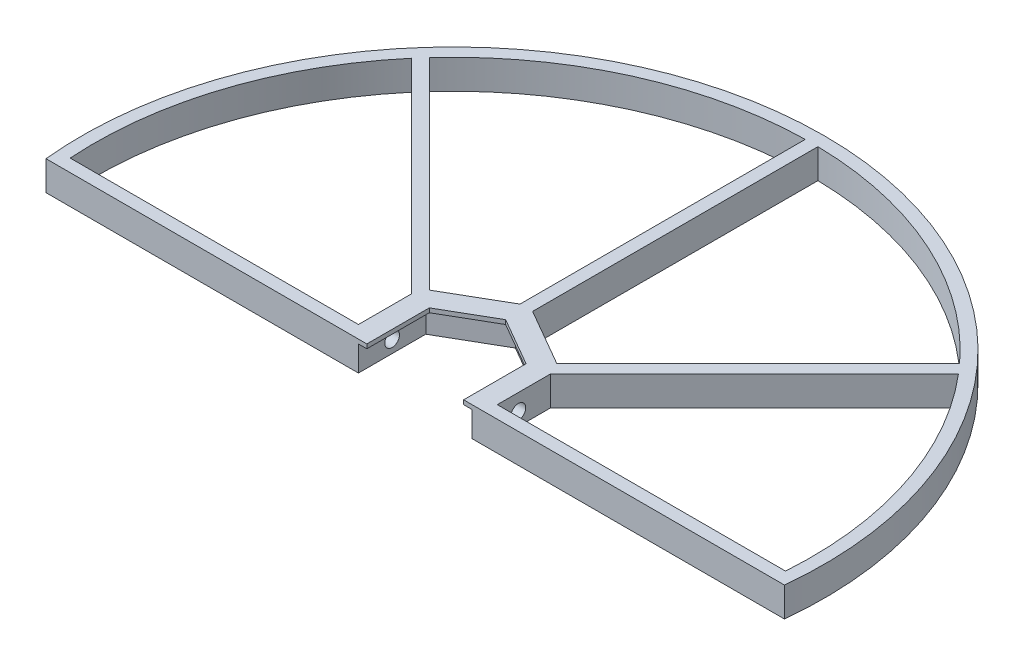
ISO-10303-21;
HEADER;
FILE_DESCRIPTION(('STEP AP214'),'2;1');
FILE_NAME('part.step','',(''),(''),'','','');
FILE_SCHEMA(('AUTOMOTIVE_DESIGN { 1 0 10303 214 1 1 1 1 }'));
ENDSEC;
DATA;
#1=APPLICATION_CONTEXT('core data for automotive mechanical design processes');
#2=APPLICATION_PROTOCOL_DEFINITION('international standard','automotive_design',2000,#1);
#3=PRODUCT_CONTEXT('',#1,'mechanical');
#4=PRODUCT('Part','Part','',(#3));
#5=PRODUCT_RELATED_PRODUCT_CATEGORY('part','',(#4));
#6=PRODUCT_DEFINITION_FORMATION('','',#4);
#7=PRODUCT_DEFINITION_CONTEXT('part definition',#1,'design');
#8=PRODUCT_DEFINITION('design','',#6,#7);
#9=PRODUCT_DEFINITION_SHAPE('','',#8);
#10=(LENGTH_UNIT() NAMED_UNIT(*) SI_UNIT(.MILLI.,.METRE.));
#11=(NAMED_UNIT(*) PLANE_ANGLE_UNIT() SI_UNIT($,.RADIAN.));
#12=(NAMED_UNIT(*) SI_UNIT($,.STERADIAN.) SOLID_ANGLE_UNIT());
#13=UNCERTAINTY_MEASURE_WITH_UNIT(LENGTH_MEASURE(1.E-05),#10,'distance_accuracy_value','');
#14=(GEOMETRIC_REPRESENTATION_CONTEXT(3) GLOBAL_UNCERTAINTY_ASSIGNED_CONTEXT((#13)) GLOBAL_UNIT_ASSIGNED_CONTEXT((#10,
#11,#12)) REPRESENTATION_CONTEXT('',''));
#15=CARTESIAN_POINT('',(0.,0.,0.));
#16=DIRECTION('',(0.,0.,1.));
#17=DIRECTION('',(1.,0.,0.));
#18=AXIS2_PLACEMENT_3D('',#15,#16,#17);
#19=CARTESIAN_POINT('',(16.5,7.,0.));
#20=DIRECTION('',(-1.,0.,0.));
#21=DIRECTION('',(0.,0.,1.));
#22=AXIS2_PLACEMENT_3D('',#19,#20,#21);
#23=PLANE('',#22);
#24=DIRECTION('',(0.,0.,-1.));
#25=VECTOR('',#24,1.);
#26=CARTESIAN_POINT('',(16.5,0.,0.));
#27=LINE('',#26,#25);
#28=CARTESIAN_POINT('',(16.5,0.,0.));
#29=VERTEX_POINT('',#28);
#30=CARTESIAN_POINT('',(16.5,0.,-12.6103877364479));
#31=VERTEX_POINT('',#30);
#32=EDGE_CURVE('E370',#29,#31,#27,.T.);
#33=ORIENTED_EDGE('',*,*,#32,.T.);
#34=DIRECTION('',(0.,-1.,0.));
#35=VECTOR('',#34,1.);
#36=CARTESIAN_POINT('',(16.5,7.,-12.6103877364479));
#37=LINE('',#36,#35);
#38=CARTESIAN_POINT('',(16.5,7.,-12.6103877364479));
#39=VERTEX_POINT('',#38);
#40=EDGE_CURVE('E413',#39,#31,#37,.T.);
#41=ORIENTED_EDGE('',*,*,#40,.F.);
#42=DIRECTION('',(0.,0.,-1.));
#43=VECTOR('',#42,1.);
#44=CARTESIAN_POINT('',(16.5,7.,0.));
#45=LINE('',#44,#43);
#46=CARTESIAN_POINT('',(16.5,7.,0.));
#47=VERTEX_POINT('',#46);
#48=EDGE_CURVE('E327',#47,#39,#45,.T.);
#49=ORIENTED_EDGE('',*,*,#48,.F.);
#50=DIRECTION('',(0.,-1.,0.));
#51=VECTOR('',#50,1.);
#52=CARTESIAN_POINT('',(16.5,7.,0.));
#53=LINE('',#52,#51);
#54=EDGE_CURVE('E416',#47,#29,#53,.T.);
#55=ORIENTED_EDGE('',*,*,#54,.T.);
#56=EDGE_LOOP('',(#33,#41,#49,#55));
#57=FACE_BOUND('',#56,.T.);
#58=CARTESIAN_POINT('',(16.5,3.,-5.0103877364479));
#59=DIRECTION('',(-1.,0.,0.));
#60=DIRECTION('',(0.,0.,1.));
#61=AXIS2_PLACEMENT_3D('',#58,#59,#60);
#62=CIRCLE('',#61,1.74999999999999);
#63=CARTESIAN_POINT('',(16.5,3.,-3.26038773644791));
#64=VERTEX_POINT('',#63);
#65=EDGE_CURVE('E284',#64,#64,#62,.F.);
#66=ORIENTED_EDGE('',*,*,#65,.F.);
#67=EDGE_LOOP('',(#66));
#68=FACE_BOUND('',#67,.T.);
#69=ADVANCED_FACE('F35',(#57,#68),#23,.F.);
#70=CARTESIAN_POINT('',(0.,7.,3.));
#71=DIRECTION('',(0.,0.,-1.));
#72=DIRECTION('',(-1.,0.,0.));
#73=AXIS2_PLACEMENT_3D('',#70,#71,#72);
#74=PLANE('',#73);
#75=DIRECTION('',(1.,0.,0.));
#76=VECTOR('',#75,1.);
#77=CARTESIAN_POINT('',(0.,0.,3.));
#78=LINE('',#77,#76);
#79=CARTESIAN_POINT('',(-87.7511766839998,0.,3.));
#80=VERTEX_POINT('',#79);
#81=CARTESIAN_POINT('',(-13.5,0.,3.));
#82=VERTEX_POINT('',#81);
#83=EDGE_CURVE('E303',#80,#82,#78,.T.);
#84=ORIENTED_EDGE('',*,*,#83,.T.);
#85=DIRECTION('',(0.,1.,0.));
#86=VECTOR('',#85,1.);
#87=CARTESIAN_POINT('',(-13.5,-3.,3.));
#88=LINE('',#87,#86);
#89=CARTESIAN_POINT('',(-13.5,6.,3.));
#90=VERTEX_POINT('',#89);
#91=EDGE_CURVE('E246',#82,#90,#88,.T.);
#92=ORIENTED_EDGE('',*,*,#91,.T.);
#93=DIRECTION('',(1.,0.,0.));
#94=VECTOR('',#93,1.);
#95=CARTESIAN_POINT('',(-13.5,6.,3.));
#96=LINE('',#95,#94);
#97=CARTESIAN_POINT('',(-11.5,6.,3.));
#98=VERTEX_POINT('',#97);
#99=EDGE_CURVE('E239',#90,#98,#96,.T.);
#100=ORIENTED_EDGE('',*,*,#99,.T.);
#101=DIRECTION('',(0.,1.,0.));
#102=VECTOR('',#101,1.);
#103=CARTESIAN_POINT('',(-11.5,6.,3.));
#104=LINE('',#103,#102);
#105=CARTESIAN_POINT('',(-11.5,7.,3.));
#106=VERTEX_POINT('',#105);
#107=EDGE_CURVE('E224',#98,#106,#104,.T.);
#108=ORIENTED_EDGE('',*,*,#107,.T.);
#109=DIRECTION('',(1.,0.,0.));
#110=VECTOR('',#109,1.);
#111=CARTESIAN_POINT('',(0.,7.,3.));
#112=LINE('',#111,#110);
#113=CARTESIAN_POINT('',(-87.7511766839998,7.,3.));
#114=VERTEX_POINT('',#113);
#115=EDGE_CURVE('E340',#114,#106,#112,.T.);
#116=ORIENTED_EDGE('',*,*,#115,.F.);
#117=DIRECTION('',(0.,-1.,0.));
#118=VECTOR('',#117,1.);
#119=CARTESIAN_POINT('',(-87.7511766839998,7.,3.));
#120=LINE('',#119,#118);
#121=EDGE_CURVE('E11',#114,#80,#120,.T.);
#122=ORIENTED_EDGE('',*,*,#121,.T.);
#123=EDGE_LOOP('',(#84,#92,#100,#108,#116,#122));
#124=FACE_BOUND('',#123,.T.);
#125=ADVANCED_FACE('F245',(#124),#74,.F.);
#126=CARTESIAN_POINT('',(0.,7.,-6.));
#127=DIRECTION('',(0.,-1.,0.));
#128=DIRECTION('',(0.,0.,-1.));
#129=AXIS2_PLACEMENT_3D('',#126,#127,#128);
#130=CYLINDRICAL_SURFACE('',#129,88.2115015710907);
#131=CARTESIAN_POINT('',(0.,0.,-6.));
#132=DIRECTION('',(0.,1.,0.));
#133=DIRECTION('',(0.,0.,1.));
#134=AXIS2_PLACEMENT_3D('',#131,#132,#133);
#135=CIRCLE('',#134,88.2115015710907);
#136=CARTESIAN_POINT('',(87.7511766839998,0.,3.));
#137=VERTEX_POINT('',#136);
#138=EDGE_CURVE('E391',#80,#137,#135,.F.);
#139=ORIENTED_EDGE('',*,*,#138,.F.);
#140=ORIENTED_EDGE('',*,*,#121,.F.);
#141=CARTESIAN_POINT('',(0.,7.,-6.));
#142=DIRECTION('',(0.,1.,0.));
#143=DIRECTION('',(0.,0.,1.));
#144=AXIS2_PLACEMENT_3D('',#141,#142,#143);
#145=CIRCLE('',#144,88.2115015710907);
#146=CARTESIAN_POINT('',(87.7511766839998,7.,3.));
#147=VERTEX_POINT('',#146);
#148=EDGE_CURVE('E336',#114,#147,#145,.F.);
#149=ORIENTED_EDGE('',*,*,#148,.T.);
#150=DIRECTION('',(0.,-1.,0.));
#151=VECTOR('',#150,1.);
#152=CARTESIAN_POINT('',(87.7511766839998,7.,3.));
#153=LINE('',#152,#151);
#154=EDGE_CURVE('E44',#147,#137,#153,.T.);
#155=ORIENTED_EDGE('',*,*,#154,.T.);
#156=EDGE_LOOP('',(#139,#140,#149,#155));
#157=FACE_BOUND('',#156,.T.);
#158=ADVANCED_FACE('F475',(#157),#130,.T.);
#159=CARTESIAN_POINT('',(13.5,7.,0.));
#160=DIRECTION('',(-1.,0.,0.));
#161=DIRECTION('',(0.,0.,1.));
#162=AXIS2_PLACEMENT_3D('',#159,#160,#161);
#163=PLANE('',#162);
#164=DIRECTION('',(0.,0.,-1.));
#165=VECTOR('',#164,1.);
#166=CARTESIAN_POINT('',(13.5,6.,-13.));
#167=LINE('',#166,#165);
#168=CARTESIAN_POINT('',(13.5,6.,3.));
#169=VERTEX_POINT('',#168);
#170=CARTESIAN_POINT('',(13.5,6.,-13.));
#171=VERTEX_POINT('',#170);
#172=EDGE_CURVE('E261',#169,#171,#167,.T.);
#173=ORIENTED_EDGE('',*,*,#172,.T.);
#174=DIRECTION('',(0.,-1.,0.));
#175=VECTOR('',#174,1.);
#176=CARTESIAN_POINT('',(13.5,7.,-13.));
#177=LINE('',#176,#175);
#178=CARTESIAN_POINT('',(13.5,0.,-13.));
#179=VERTEX_POINT('',#178);
#180=EDGE_CURVE('E399',#171,#179,#177,.T.);
#181=ORIENTED_EDGE('',*,*,#180,.T.);
#182=DIRECTION('',(0.,0.,-1.));
#183=VECTOR('',#182,1.);
#184=CARTESIAN_POINT('',(13.5,0.,0.));
#185=LINE('',#184,#183);
#186=CARTESIAN_POINT('',(13.5,0.,3.));
#187=VERTEX_POINT('',#186);
#188=EDGE_CURVE('E379',#187,#179,#185,.T.);
#189=ORIENTED_EDGE('',*,*,#188,.F.);
#190=DIRECTION('',(0.,1.,0.));
#191=VECTOR('',#190,1.);
#192=CARTESIAN_POINT('',(13.5,-3.,3.));
#193=LINE('',#192,#191);
#194=EDGE_CURVE('E295',#187,#169,#193,.T.);
#195=ORIENTED_EDGE('',*,*,#194,.T.);
#196=EDGE_LOOP('',(#173,#181,#189,#195));
#197=FACE_BOUND('',#196,.T.);
#198=CARTESIAN_POINT('',(13.5,3.,-5.0103877364479));
#199=DIRECTION('',(-1.,0.,0.));
#200=DIRECTION('',(0.,0.,1.));
#201=AXIS2_PLACEMENT_3D('',#198,#199,#200);
#202=CIRCLE('',#201,1.74999999999999);
#203=CARTESIAN_POINT('',(13.5,3.,-3.26038773644791));
#204=VERTEX_POINT('',#203);
#205=EDGE_CURVE('E292',#204,#204,#202,.T.);
#206=ORIENTED_EDGE('',*,*,#205,.F.);
#207=EDGE_LOOP('',(#206));
#208=FACE_BOUND('',#207,.T.);
#209=ADVANCED_FACE('F513',(#197,#208),#163,.T.);
#210=CARTESIAN_POINT('',(-13.5,7.,0.));
#211=DIRECTION('',(-1.,0.,0.));
#212=DIRECTION('',(0.,0.,1.));
#213=AXIS2_PLACEMENT_3D('',#210,#211,#212);
#214=PLANE('',#213);
#215=CARTESIAN_POINT('',(-13.5,3.,-5.01038773644791));
#216=DIRECTION('',(-1.,0.,0.));
#217=DIRECTION('',(0.,0.,1.));
#218=AXIS2_PLACEMENT_3D('',#215,#216,#217);
#219=CIRCLE('',#218,1.74999999999999);
#220=CARTESIAN_POINT('',(-13.5,3.,-3.26038773644792));
#221=VERTEX_POINT('',#220);
#222=EDGE_CURVE('E287',#221,#221,#219,.T.);
#223=ORIENTED_EDGE('',*,*,#222,.T.);
#224=EDGE_LOOP('',(#223));
#225=FACE_BOUND('',#224,.T.);
#226=DIRECTION('',(0.,-1.,0.));
#227=VECTOR('',#226,1.);
#228=CARTESIAN_POINT('',(-13.5,7.,-13.));
#229=LINE('',#228,#227);
#230=CARTESIAN_POINT('',(-13.5,6.,-13.));
#231=VERTEX_POINT('',#230);
#232=CARTESIAN_POINT('',(-13.5,0.,-13.));
#233=VERTEX_POINT('',#232);
#234=EDGE_CURVE('E397',#231,#233,#229,.T.);
#235=ORIENTED_EDGE('',*,*,#234,.F.);
#236=DIRECTION('',(0.,0.,1.));
#237=VECTOR('',#236,1.);
#238=CARTESIAN_POINT('',(-13.5,6.,3.));
#239=LINE('',#238,#237);
#240=EDGE_CURVE('E52',#231,#90,#239,.T.);
#241=ORIENTED_EDGE('',*,*,#240,.T.);
#242=ORIENTED_EDGE('',*,*,#91,.F.);
#243=DIRECTION('',(0.,0.,-1.));
#244=VECTOR('',#243,1.);
#245=CARTESIAN_POINT('',(-13.5,0.,0.));
#246=LINE('',#245,#244);
#247=EDGE_CURVE('E382',#82,#233,#246,.T.);
#248=ORIENTED_EDGE('',*,*,#247,.T.);
#249=EDGE_LOOP('',(#235,#241,#242,#248));
#250=FACE_BOUND('',#249,.T.);
#251=ADVANCED_FACE('F519',(#225,#250),#214,.F.);
#252=CARTESIAN_POINT('',(-9.00728248364844,7.,-15.594898338575));
#253=DIRECTION('',(-0.500148405385889,0.,-0.865939704939063));
#254=DIRECTION('',(-0.865939704939063,0.,0.500148405385889));
#255=AXIS2_PLACEMENT_3D('',#252,#253,#254);
#256=PLANE('',#255);
#257=DIRECTION('',(0.,-1.,0.));
#258=VECTOR('',#257,1.);
#259=CARTESIAN_POINT('',(0.,7.,-20.797313639966));
#260=LINE('',#259,#258);
#261=CARTESIAN_POINT('',(0.,6.,-20.797313639966));
#262=VERTEX_POINT('',#261);
#263=CARTESIAN_POINT('',(0.,0.,-20.797313639966));
#264=VERTEX_POINT('',#263);
#265=EDGE_CURVE('E401',#262,#264,#260,.T.);
#266=ORIENTED_EDGE('',*,*,#265,.F.);
#267=DIRECTION('',(-0.865939704939063,0.,0.500148405385889));
#268=VECTOR('',#267,1.);
#269=CARTESIAN_POINT('',(-13.5,6.,-13.));
#270=LINE('',#269,#268);
#271=EDGE_CURVE('E60',#262,#231,#270,.T.);
#272=ORIENTED_EDGE('',*,*,#271,.T.);
#273=ORIENTED_EDGE('',*,*,#234,.T.);
#274=DIRECTION('',(0.865939704939063,0.,-0.500148405385889));
#275=VECTOR('',#274,1.);
#276=CARTESIAN_POINT('',(-9.00728248364844,0.,-15.594898338575));
#277=LINE('',#276,#275);
#278=EDGE_CURVE('E385',#233,#264,#277,.T.);
#279=ORIENTED_EDGE('',*,*,#278,.T.);
#280=EDGE_LOOP('',(#266,#272,#273,#279));
#281=FACE_BOUND('',#280,.T.);
#282=ADVANCED_FACE('F516',(#281),#256,.F.);
#283=CARTESIAN_POINT('',(0.,7.,-6.));
#284=DIRECTION('',(0.,-1.,0.));
#285=DIRECTION('',(0.,0.,-1.));
#286=AXIS2_PLACEMENT_3D('',#283,#284,#285);
#287=CYLINDRICAL_SURFACE('',#286,85.2115015710907);
#288=CARTESIAN_POINT('',(0.,0.,-6.));
#289=DIRECTION('',(0.,1.,0.));
#290=DIRECTION('',(0.,0.,1.));
#291=AXIS2_PLACEMENT_3D('',#288,#289,#290);
#292=CIRCLE('',#291,85.2115015710907);
#293=CARTESIAN_POINT('',(-85.,0.,0.));
#294=VERTEX_POINT('',#293);
#295=CARTESIAN_POINT('',(-64.9951924112923,0.,-61.1055801477408));
#296=VERTEX_POINT('',#295);
#297=EDGE_CURVE('E349',#294,#296,#292,.F.);
#298=ORIENTED_EDGE('',*,*,#297,.T.);
#299=DIRECTION('',(0.,-1.,0.));
#300=VECTOR('',#299,1.);
#301=CARTESIAN_POINT('',(-64.9951924112923,7.,-61.1055801477408));
#302=LINE('',#301,#300);
#303=CARTESIAN_POINT('',(-64.9951924112923,7.,-61.1055801477408));
#304=VERTEX_POINT('',#303);
#305=EDGE_CURVE('E402',#304,#296,#302,.T.);
#306=ORIENTED_EDGE('',*,*,#305,.F.);
#307=CARTESIAN_POINT('',(0.,7.,-6.));
#308=DIRECTION('',(0.,1.,0.));
#309=DIRECTION('',(0.,0.,1.));
#310=AXIS2_PLACEMENT_3D('',#307,#308,#309);
#311=CIRCLE('',#310,85.2115015710907);
#312=CARTESIAN_POINT('',(-85.,7.,0.));
#313=VERTEX_POINT('',#312);
#314=EDGE_CURVE('E306',#313,#304,#311,.F.);
#315=ORIENTED_EDGE('',*,*,#314,.F.);
#316=DIRECTION('',(0.,-1.,0.));
#317=VECTOR('',#316,1.);
#318=CARTESIAN_POINT('',(-85.,7.,0.));
#319=LINE('',#318,#317);
#320=EDGE_CURVE('E405',#313,#294,#319,.T.);
#321=ORIENTED_EDGE('',*,*,#320,.T.);
#322=EDGE_LOOP('',(#298,#306,#315,#321));
#323=FACE_BOUND('',#322,.T.);
#324=ADVANCED_FACE('F467',(#323),#287,.F.);
#325=CARTESIAN_POINT('',(-1.94480613177613,7.,1.94480613177611));
#326=DIRECTION('',(-0.707106781186551,0.,0.707106781186544));
#327=DIRECTION('',(0.707106781186544,0.,0.707106781186551));
#328=AXIS2_PLACEMENT_3D('',#325,#326,#327);
#329=PLANE('',#328);
#330=DIRECTION('',(-0.707106781186544,0.,-0.707106781186551));
#331=VECTOR('',#330,1.);
#332=CARTESIAN_POINT('',(-1.94480613177613,0.,1.94480613177611));
#333=LINE('',#332,#331);
#334=CARTESIAN_POINT('',(-16.5,0.,-12.6103877364479));
#335=VERTEX_POINT('',#334);
#336=EDGE_CURVE('E373',#335,#296,#333,.T.);
#337=ORIENTED_EDGE('',*,*,#336,.F.);
#338=DIRECTION('',(0.,-1.,0.));
#339=VECTOR('',#338,1.);
#340=CARTESIAN_POINT('',(-16.5,7.,-12.6103877364479));
#341=LINE('',#340,#339);
#342=CARTESIAN_POINT('',(-16.5,7.,-12.6103877364479));
#343=VERTEX_POINT('',#342);
#344=EDGE_CURVE('E410',#343,#335,#341,.T.);
#345=ORIENTED_EDGE('',*,*,#344,.F.);
#346=DIRECTION('',(-0.707106781186544,0.,-0.707106781186551));
#347=VECTOR('',#346,1.);
#348=CARTESIAN_POINT('',(-1.94480613177613,7.,1.94480613177611));
#349=LINE('',#348,#347);
#350=EDGE_CURVE('E330',#343,#304,#349,.T.);
#351=ORIENTED_EDGE('',*,*,#350,.T.);
#352=ORIENTED_EDGE('',*,*,#305,.T.);
#353=EDGE_LOOP('',(#337,#345,#351,#352));
#354=FACE_BOUND('',#353,.T.);
#355=ADVANCED_FACE('F530',(#354),#329,.T.);
#356=CARTESIAN_POINT('',(-16.5,7.,0.));
#357=DIRECTION('',(-1.,0.,0.));
#358=DIRECTION('',(0.,0.,1.));
#359=AXIS2_PLACEMENT_3D('',#356,#357,#358);
#360=PLANE('',#359);
#361=CARTESIAN_POINT('',(-16.5,3.,-5.01038773644791));
#362=DIRECTION('',(-1.,0.,0.));
#363=DIRECTION('',(0.,0.,1.));
#364=AXIS2_PLACEMENT_3D('',#361,#362,#363);
#365=CIRCLE('',#364,1.74999999999999);
#366=CARTESIAN_POINT('',(-16.5,3.,-3.26038773644792));
#367=VERTEX_POINT('',#366);
#368=EDGE_CURVE('E278',#367,#367,#365,.T.);
#369=ORIENTED_EDGE('',*,*,#368,.F.);
#370=EDGE_LOOP('',(#369));
#371=FACE_BOUND('',#370,.T.);
#372=DIRECTION('',(0.,0.,-1.));
#373=VECTOR('',#372,1.);
#374=CARTESIAN_POINT('',(-16.5,0.,0.));
#375=LINE('',#374,#373);
#376=CARTESIAN_POINT('',(-16.5,0.,0.));
#377=VERTEX_POINT('',#376);
#378=EDGE_CURVE('E376',#377,#335,#375,.T.);
#379=ORIENTED_EDGE('',*,*,#378,.F.);
#380=DIRECTION('',(0.,-1.,0.));
#381=VECTOR('',#380,1.);
#382=CARTESIAN_POINT('',(-16.5,7.,0.));
#383=LINE('',#382,#381);
#384=CARTESIAN_POINT('',(-16.5,7.,0.));
#385=VERTEX_POINT('',#384);
#386=EDGE_CURVE('E407',#385,#377,#383,.T.);
#387=ORIENTED_EDGE('',*,*,#386,.F.);
#388=DIRECTION('',(0.,0.,-1.));
#389=VECTOR('',#388,1.);
#390=CARTESIAN_POINT('',(-16.5,7.,0.));
#391=LINE('',#390,#389);
#392=EDGE_CURVE('E333',#385,#343,#391,.T.);
#393=ORIENTED_EDGE('',*,*,#392,.T.);
#394=ORIENTED_EDGE('',*,*,#344,.T.);
#395=EDGE_LOOP('',(#379,#387,#393,#394));
#396=FACE_BOUND('',#395,.T.);
#397=ADVANCED_FACE('F485',(#371,#396),#360,.T.);
#398=CARTESIAN_POINT('',(1.94480613177614,7.,1.94480613177612));
#399=DIRECTION('',(-0.707106781186552,0.,-0.707106781186544));
#400=DIRECTION('',(-0.707106781186544,0.,0.707106781186552));
#401=AXIS2_PLACEMENT_3D('',#398,#399,#400);
#402=PLANE('',#401);
#403=DIRECTION('',(0.707106781186544,0.,-0.707106781186552));
#404=VECTOR('',#403,1.);
#405=CARTESIAN_POINT('',(1.94480613177614,0.,1.94480613177612));
#406=LINE('',#405,#404);
#407=CARTESIAN_POINT('',(64.9951924112923,0.,-61.1055801477408));
#408=VERTEX_POINT('',#407);
#409=EDGE_CURVE('E363',#31,#408,#406,.T.);
#410=ORIENTED_EDGE('',*,*,#409,.T.);
#411=DIRECTION('',(0.,-1.,0.));
#412=VECTOR('',#411,1.);
#413=CARTESIAN_POINT('',(64.9951924112923,7.,-61.1055801477408));
#414=LINE('',#413,#412);
#415=CARTESIAN_POINT('',(64.9951924112923,7.,-61.1055801477408));
#416=VERTEX_POINT('',#415);
#417=EDGE_CURVE('E408',#416,#408,#414,.T.);
#418=ORIENTED_EDGE('',*,*,#417,.F.);
#419=DIRECTION('',(0.707106781186544,0.,-0.707106781186552));
#420=VECTOR('',#419,1.);
#421=CARTESIAN_POINT('',(1.94480613177614,7.,1.94480613177612));
#422=LINE('',#421,#420);
#423=EDGE_CURVE('E320',#39,#416,#422,.T.);
#424=ORIENTED_EDGE('',*,*,#423,.F.);
#425=ORIENTED_EDGE('',*,*,#40,.T.);
#426=EDGE_LOOP('',(#410,#418,#424,#425));
#427=FACE_BOUND('',#426,.T.);
#428=ADVANCED_FACE('F481',(#427),#402,.F.);
#429=CARTESIAN_POINT('',(85.,0.,0.));
#430=VERTEX_POINT('',#429);
#431=EDGE_CURVE('E366',#408,#430,#292,.F.);
#432=ORIENTED_EDGE('',*,*,#431,.T.);
#433=DIRECTION('',(0.,-1.,0.));
#434=VECTOR('',#433,1.);
#435=CARTESIAN_POINT('',(85.,7.,0.));
#436=LINE('',#435,#434);
#437=CARTESIAN_POINT('',(85.,7.,0.));
#438=VERTEX_POINT('',#437);
#439=EDGE_CURVE('E419',#438,#430,#436,.T.);
#440=ORIENTED_EDGE('',*,*,#439,.F.);
#441=EDGE_CURVE('E323',#416,#438,#311,.F.);
#442=ORIENTED_EDGE('',*,*,#441,.F.);
#443=ORIENTED_EDGE('',*,*,#417,.T.);
#444=EDGE_LOOP('',(#432,#440,#442,#443));
#445=FACE_BOUND('',#444,.T.);
#446=ADVANCED_FACE('F484',(#445),#287,.F.);
#447=CARTESIAN_POINT('',(0.,7.,0.));
#448=DIRECTION('',(0.,0.,-1.));
#449=DIRECTION('',(-1.,0.,0.));
#450=AXIS2_PLACEMENT_3D('',#447,#448,#449);
#451=PLANE('',#450);
#452=DIRECTION('',(1.,0.,0.));
#453=VECTOR('',#452,1.);
#454=CARTESIAN_POINT('',(0.,0.,0.));
#455=LINE('',#454,#453);
#456=EDGE_CURVE('E367',#29,#430,#455,.T.);
#457=ORIENTED_EDGE('',*,*,#456,.F.);
#458=ORIENTED_EDGE('',*,*,#54,.F.);
#459=DIRECTION('',(1.,0.,0.));
#460=VECTOR('',#459,1.);
#461=CARTESIAN_POINT('',(0.,7.,0.));
#462=LINE('',#461,#460);
#463=EDGE_CURVE('E324',#47,#438,#462,.T.);
#464=ORIENTED_EDGE('',*,*,#463,.T.);
#465=ORIENTED_EDGE('',*,*,#439,.T.);
#466=EDGE_LOOP('',(#457,#458,#464,#465));
#467=FACE_BOUND('',#466,.T.);
#468=ADVANCED_FACE('F497',(#467),#451,.T.);
#469=CARTESIAN_POINT('',(1.50000000000001,7.,0.));
#470=DIRECTION('',(-1.,0.,0.));
#471=DIRECTION('',(0.,0.,1.));
#472=AXIS2_PLACEMENT_3D('',#469,#470,#471);
#473=PLANE('',#472);
#474=DIRECTION('',(0.,0.,-1.));
#475=VECTOR('',#474,1.);
#476=CARTESIAN_POINT('',(1.50000000000001,0.,0.));
#477=LINE('',#476,#475);
#478=CARTESIAN_POINT('',(1.50000000000001,0.,-23.395389902192));
#479=VERTEX_POINT('',#478);
#480=CARTESIAN_POINT('',(1.49999999999999,0.,-91.1982981050678));
#481=VERTEX_POINT('',#480);
#482=EDGE_CURVE('E356',#479,#481,#477,.T.);
#483=ORIENTED_EDGE('',*,*,#482,.T.);
#484=DIRECTION('',(0.,-1.,0.));
#485=VECTOR('',#484,1.);
#486=CARTESIAN_POINT('',(1.49999999999999,7.,-91.1982981050678));
#487=LINE('',#486,#485);
#488=CARTESIAN_POINT('',(1.49999999999999,7.,-91.1982981050678));
#489=VERTEX_POINT('',#488);
#490=EDGE_CURVE('E417',#489,#481,#487,.T.);
#491=ORIENTED_EDGE('',*,*,#490,.F.);
#492=DIRECTION('',(0.,0.,-1.));
#493=VECTOR('',#492,1.);
#494=CARTESIAN_POINT('',(1.50000000000001,7.,0.));
#495=LINE('',#494,#493);
#496=CARTESIAN_POINT('',(1.50000000000001,7.,-23.395389902192));
#497=VERTEX_POINT('',#496);
#498=EDGE_CURVE('E313',#497,#489,#495,.T.);
#499=ORIENTED_EDGE('',*,*,#498,.F.);
#500=DIRECTION('',(0.,-1.,0.));
#501=VECTOR('',#500,1.);
#502=CARTESIAN_POINT('',(1.50000000000001,7.,-23.395389902192));
#503=LINE('',#502,#501);
#504=EDGE_CURVE('E423',#497,#479,#503,.T.);
#505=ORIENTED_EDGE('',*,*,#504,.T.);
#506=EDGE_LOOP('',(#483,#491,#499,#505));
#507=FACE_BOUND('',#506,.T.);
#508=ADVANCED_FACE('F495',(#507),#473,.F.);
#509=CARTESIAN_POINT('',(63.0109257404499,0.,-63.3639541640176));
#510=VERTEX_POINT('',#509);
#511=EDGE_CURVE('E350',#481,#510,#292,.F.);
#512=ORIENTED_EDGE('',*,*,#511,.T.);
#513=DIRECTION('',(0.,-1.,0.));
#514=VECTOR('',#513,1.);
#515=CARTESIAN_POINT('',(63.0109257404499,7.,-63.3639541640176));
#516=LINE('',#515,#514);
#517=CARTESIAN_POINT('',(63.0109257404499,7.,-63.3639541640176));
#518=VERTEX_POINT('',#517);
#519=EDGE_CURVE('E429',#518,#510,#516,.T.);
#520=ORIENTED_EDGE('',*,*,#519,.F.);
#521=EDGE_CURVE('E307',#489,#518,#311,.F.);
#522=ORIENTED_EDGE('',*,*,#521,.F.);
#523=ORIENTED_EDGE('',*,*,#490,.T.);
#524=EDGE_LOOP('',(#512,#520,#522,#523));
#525=FACE_BOUND('',#524,.T.);
#526=ADVANCED_FACE('F466',(#525),#287,.F.);
#527=CARTESIAN_POINT('',(-0.176514211783522,7.,-0.176514211783521));
#528=DIRECTION('',(0.707106781186551,0.,0.707106781186544));
#529=DIRECTION('',(0.707106781186544,0.,-0.707106781186551));
#530=AXIS2_PLACEMENT_3D('',#527,#528,#529);
#531=PLANE('',#530);
#532=DIRECTION('',(-0.707106781186544,0.,0.707106781186551));
#533=VECTOR('',#532,1.);
#534=CARTESIAN_POINT('',(-0.176514211783522,0.,-0.176514211783521));
#535=LINE('',#534,#533);
#536=CARTESIAN_POINT('',(15.1553316008685,0.,-15.5083600244357));
#537=VERTEX_POINT('',#536);
#538=EDGE_CURVE('E359',#510,#537,#535,.T.);
#539=ORIENTED_EDGE('',*,*,#538,.T.);
#540=DIRECTION('',(0.,-1.,0.));
#541=VECTOR('',#540,1.);
#542=CARTESIAN_POINT('',(15.1553316008685,7.,-15.5083600244357));
#543=LINE('',#542,#541);
#544=CARTESIAN_POINT('',(15.1553316008685,7.,-15.5083600244357));
#545=VERTEX_POINT('',#544);
#546=EDGE_CURVE('E426',#545,#537,#543,.T.);
#547=ORIENTED_EDGE('',*,*,#546,.F.);
#548=DIRECTION('',(-0.707106781186544,0.,0.707106781186551));
#549=VECTOR('',#548,1.);
#550=CARTESIAN_POINT('',(-0.176514211783522,7.,-0.176514211783521));
#551=LINE('',#550,#549);
#552=EDGE_CURVE('E316',#518,#545,#551,.T.);
#553=ORIENTED_EDGE('',*,*,#552,.F.);
#554=ORIENTED_EDGE('',*,*,#519,.T.);
#555=EDGE_LOOP('',(#539,#547,#553,#554));
#556=FACE_BOUND('',#555,.T.);
#557=ADVANCED_FACE('F491',(#556),#531,.F.);
#558=CARTESIAN_POINT('',(0.176514211783527,7.,-0.176514211783526));
#559=DIRECTION('',(0.707106781186551,0.,-0.707106781186544));
#560=DIRECTION('',(-0.707106781186544,0.,-0.707106781186551));
#561=AXIS2_PLACEMENT_3D('',#558,#559,#560);
#562=PLANE('',#561);
#563=DIRECTION('',(0.707106781186544,0.,0.707106781186551));
#564=VECTOR('',#563,1.);
#565=CARTESIAN_POINT('',(0.176514211783527,0.,-0.176514211783526));
#566=LINE('',#565,#564);
#567=CARTESIAN_POINT('',(-63.0109257404499,0.,-63.3639541640176));
#568=VERTEX_POINT('',#567);
#569=CARTESIAN_POINT('',(-15.1553316008685,0.,-15.5083600244357));
#570=VERTEX_POINT('',#569);
#571=EDGE_CURVE('E297',#568,#570,#566,.T.);
#572=ORIENTED_EDGE('',*,*,#571,.F.);
#573=DIRECTION('',(0.,-1.,0.));
#574=VECTOR('',#573,1.);
#575=CARTESIAN_POINT('',(-63.0109257404499,7.,-63.3639541640176));
#576=LINE('',#575,#574);
#577=CARTESIAN_POINT('',(-63.0109257404499,7.,-63.3639541640176));
#578=VERTEX_POINT('',#577);
#579=EDGE_CURVE('E39',#578,#568,#576,.T.);
#580=ORIENTED_EDGE('',*,*,#579,.F.);
#581=DIRECTION('',(0.707106781186544,0.,0.707106781186551));
#582=VECTOR('',#581,1.);
#583=CARTESIAN_POINT('',(0.176514211783527,7.,-0.176514211783526));
#584=LINE('',#583,#582);
#585=CARTESIAN_POINT('',(-15.1553316008685,7.,-15.5083600244357));
#586=VERTEX_POINT('',#585);
#587=EDGE_CURVE('E299',#578,#586,#584,.T.);
#588=ORIENTED_EDGE('',*,*,#587,.T.);
#589=DIRECTION('',(0.,-1.,0.));
#590=VECTOR('',#589,1.);
#591=CARTESIAN_POINT('',(-15.1553316008685,7.,-15.5083600244357));
#592=LINE('',#591,#590);
#593=EDGE_CURVE('E342',#586,#570,#592,.T.);
#594=ORIENTED_EDGE('',*,*,#593,.T.);
#595=EDGE_LOOP('',(#572,#580,#588,#594));
#596=FACE_BOUND('',#595,.T.);
#597=ADVANCED_FACE('F37',(#596),#562,.T.);
#598=CARTESIAN_POINT('',(-1.49999999999999,0.,-91.1982981050678));
#599=VERTEX_POINT('',#598);
#600=EDGE_CURVE('E345',#568,#599,#292,.F.);
#601=ORIENTED_EDGE('',*,*,#600,.T.);
#602=DIRECTION('',(0.,-1.,0.));
#603=VECTOR('',#602,1.);
#604=CARTESIAN_POINT('',(-1.49999999999999,7.,-91.1982981050678));
#605=LINE('',#604,#603);
#606=CARTESIAN_POINT('',(-1.49999999999999,7.,-91.1982981050678));
#607=VERTEX_POINT('',#606);
#608=EDGE_CURVE('E436',#607,#599,#605,.T.);
#609=ORIENTED_EDGE('',*,*,#608,.F.);
#610=EDGE_CURVE('E302',#578,#607,#311,.F.);
#611=ORIENTED_EDGE('',*,*,#610,.F.);
#612=ORIENTED_EDGE('',*,*,#579,.T.);
#613=EDGE_LOOP('',(#601,#609,#611,#612));
#614=FACE_BOUND('',#613,.T.);
#615=ADVANCED_FACE('F443',(#614),#287,.F.);
#616=CARTESIAN_POINT('',(-1.49999999999999,7.,0.));
#617=DIRECTION('',(-1.,0.,0.));
#618=DIRECTION('',(0.,0.,1.));
#619=AXIS2_PLACEMENT_3D('',#616,#617,#618);
#620=PLANE('',#619);
#621=DIRECTION('',(0.,0.,-1.));
#622=VECTOR('',#621,1.);
#623=CARTESIAN_POINT('',(-1.49999999999999,0.,0.));
#624=LINE('',#623,#622);
#625=CARTESIAN_POINT('',(-1.49999999999999,0.,-23.395389902192));
#626=VERTEX_POINT('',#625);
#627=EDGE_CURVE('E348',#626,#599,#624,.T.);
#628=ORIENTED_EDGE('',*,*,#627,.F.);
#629=DIRECTION('',(0.,-1.,0.));
#630=VECTOR('',#629,1.);
#631=CARTESIAN_POINT('',(-1.49999999999999,7.,-23.395389902192));
#632=LINE('',#631,#630);
#633=CARTESIAN_POINT('',(-1.49999999999999,7.,-23.395389902192));
#634=VERTEX_POINT('',#633);
#635=EDGE_CURVE('E435',#634,#626,#632,.T.);
#636=ORIENTED_EDGE('',*,*,#635,.F.);
#637=DIRECTION('',(0.,0.,-1.));
#638=VECTOR('',#637,1.);
#639=CARTESIAN_POINT('',(-1.49999999999999,7.,0.));
#640=LINE('',#639,#638);
#641=EDGE_CURVE('E305',#634,#607,#640,.T.);
#642=ORIENTED_EDGE('',*,*,#641,.T.);
#643=ORIENTED_EDGE('',*,*,#608,.T.);
#644=EDGE_LOOP('',(#628,#636,#642,#643));
#645=FACE_BOUND('',#644,.T.);
#646=ADVANCED_FACE('F455',(#645),#620,.T.);
#647=CARTESIAN_POINT('',(9.00728248364844,7.,-15.594898338575));
#648=DIRECTION('',(-0.500148405385889,0.,0.865939704939064));
#649=DIRECTION('',(0.865939704939064,0.,0.500148405385889));
#650=AXIS2_PLACEMENT_3D('',#647,#648,#649);
#651=PLANE('',#650);
#652=DIRECTION('',(-0.865939704939064,0.,-0.500148405385889));
#653=VECTOR('',#652,1.);
#654=CARTESIAN_POINT('',(0.,6.,-20.797313639966));
#655=LINE('',#654,#653);
#656=EDGE_CURVE('E263',#171,#262,#655,.T.);
#657=ORIENTED_EDGE('',*,*,#656,.T.);
#658=ORIENTED_EDGE('',*,*,#265,.T.);
#659=DIRECTION('',(-0.865939704939064,0.,-0.500148405385889));
#660=VECTOR('',#659,1.);
#661=CARTESIAN_POINT('',(9.00728248364844,0.,-15.594898338575));
#662=LINE('',#661,#660);
#663=EDGE_CURVE('E388',#179,#264,#662,.T.);
#664=ORIENTED_EDGE('',*,*,#663,.F.);
#665=ORIENTED_EDGE('',*,*,#180,.F.);
#666=EDGE_LOOP('',(#657,#658,#664,#665));
#667=FACE_BOUND('',#666,.T.);
#668=ADVANCED_FACE('F457',(#667),#651,.T.);
#669=EDGE_CURVE('E371',#294,#377,#455,.T.);
#670=ORIENTED_EDGE('',*,*,#669,.F.);
#671=ORIENTED_EDGE('',*,*,#320,.F.);
#672=EDGE_CURVE('E328',#313,#385,#462,.T.);
#673=ORIENTED_EDGE('',*,*,#672,.T.);
#674=ORIENTED_EDGE('',*,*,#386,.T.);
#675=EDGE_LOOP('',(#670,#671,#673,#674));
#676=FACE_BOUND('',#675,.T.);
#677=ADVANCED_FACE('F462',(#676),#451,.T.);
#678=CARTESIAN_POINT('',(10.5077276998061,7.,-18.1927174533922));
#679=DIRECTION('',(-0.500148405385889,0.,0.865939704939064));
#680=DIRECTION('',(0.865939704939064,0.,0.500148405385889));
#681=AXIS2_PLACEMENT_3D('',#678,#679,#680);
#682=PLANE('',#681);
#683=DIRECTION('',(-0.865939704939064,0.,-0.500148405385889));
#684=VECTOR('',#683,1.);
#685=CARTESIAN_POINT('',(10.5077276998061,0.,-18.1927174533922));
#686=LINE('',#685,#684);
#687=EDGE_CURVE('E361',#537,#479,#686,.T.);
#688=ORIENTED_EDGE('',*,*,#687,.T.);
#689=ORIENTED_EDGE('',*,*,#504,.F.);
#690=DIRECTION('',(-0.865939704939064,0.,-0.500148405385889));
#691=VECTOR('',#690,1.);
#692=CARTESIAN_POINT('',(10.5077276998061,7.,-18.1927174533922));
#693=LINE('',#692,#691);
#694=EDGE_CURVE('E318',#545,#497,#693,.T.);
#695=ORIENTED_EDGE('',*,*,#694,.F.);
#696=ORIENTED_EDGE('',*,*,#546,.T.);
#697=EDGE_LOOP('',(#688,#689,#695,#696));
#698=FACE_BOUND('',#697,.T.);
#699=ADVANCED_FACE('F487',(#698),#682,.F.);
#700=CARTESIAN_POINT('',(-10.5077276998061,7.,-18.1927174533922));
#701=DIRECTION('',(-0.500148405385889,0.,-0.865939704939063));
#702=DIRECTION('',(-0.865939704939063,0.,0.500148405385889));
#703=AXIS2_PLACEMENT_3D('',#700,#701,#702);
#704=PLANE('',#703);
#705=DIRECTION('',(0.865939704939063,0.,-0.500148405385889));
#706=VECTOR('',#705,1.);
#707=CARTESIAN_POINT('',(-10.5077276998061,0.,-18.1927174533922));
#708=LINE('',#707,#706);
#709=EDGE_CURVE('E353',#570,#626,#708,.T.);
#710=ORIENTED_EDGE('',*,*,#709,.F.);
#711=ORIENTED_EDGE('',*,*,#593,.F.);
#712=DIRECTION('',(0.865939704939063,0.,-0.500148405385889));
#713=VECTOR('',#712,1.);
#714=CARTESIAN_POINT('',(-10.5077276998061,7.,-18.1927174533922));
#715=LINE('',#714,#713);
#716=EDGE_CURVE('E310',#586,#634,#715,.T.);
#717=ORIENTED_EDGE('',*,*,#716,.T.);
#718=ORIENTED_EDGE('',*,*,#635,.T.);
#719=EDGE_LOOP('',(#710,#711,#717,#718));
#720=FACE_BOUND('',#719,.T.);
#721=ADVANCED_FACE('F453',(#720),#704,.T.);
#722=CARTESIAN_POINT('',(11.5,7.,3.));
#723=VERTEX_POINT('',#722);
#724=EDGE_CURVE('E339',#723,#147,#112,.T.);
#725=ORIENTED_EDGE('',*,*,#724,.F.);
#726=DIRECTION('',(0.,1.,0.));
#727=VECTOR('',#726,1.);
#728=CARTESIAN_POINT('',(11.5,6.,3.));
#729=LINE('',#728,#727);
#730=CARTESIAN_POINT('',(11.5,6.,3.));
#731=VERTEX_POINT('',#730);
#732=EDGE_CURVE('E275',#731,#723,#729,.T.);
#733=ORIENTED_EDGE('',*,*,#732,.F.);
#734=DIRECTION('',(1.,0.,0.));
#735=VECTOR('',#734,1.);
#736=CARTESIAN_POINT('',(11.5,6.,3.));
#737=LINE('',#736,#735);
#738=EDGE_CURVE('E258',#731,#169,#737,.T.);
#739=ORIENTED_EDGE('',*,*,#738,.T.);
#740=ORIENTED_EDGE('',*,*,#194,.F.);
#741=EDGE_CURVE('E394',#187,#137,#78,.T.);
#742=ORIENTED_EDGE('',*,*,#741,.T.);
#743=ORIENTED_EDGE('',*,*,#154,.F.);
#744=EDGE_LOOP('',(#725,#733,#739,#740,#742,#743));
#745=FACE_BOUND('',#744,.T.);
#746=ADVANCED_FACE('F477',(#745),#74,.F.);
#747=CARTESIAN_POINT('',(0.,7.,0.));
#748=DIRECTION('',(0.,1.,0.));
#749=DIRECTION('',(0.,0.,1.));
#750=AXIS2_PLACEMENT_3D('',#747,#748,#749);
#751=PLANE('',#750);
#752=ORIENTED_EDGE('',*,*,#115,.T.);
#753=DIRECTION('',(0.,0.,-1.));
#754=VECTOR('',#753,1.);
#755=CARTESIAN_POINT('',(-11.5,7.,3.));
#756=LINE('',#755,#754);
#757=CARTESIAN_POINT('',(-11.5,7.,-11.8455279466616));
#758=VERTEX_POINT('',#757);
#759=EDGE_CURVE('E229',#106,#758,#756,.T.);
#760=ORIENTED_EDGE('',*,*,#759,.T.);
#761=DIRECTION('',(0.865939704939064,0.,-0.500148405385889));
#762=VECTOR('',#761,1.);
#763=CARTESIAN_POINT('',(-11.5,7.,-11.8455279466616));
#764=LINE('',#763,#762);
#765=CARTESIAN_POINT('',(0.,7.,-18.4876840103364));
#766=VERTEX_POINT('',#765);
#767=EDGE_CURVE('E267',#758,#766,#764,.T.);
#768=ORIENTED_EDGE('',*,*,#767,.T.);
#769=DIRECTION('',(0.865939704939064,0.,0.500148405385889));
#770=VECTOR('',#769,1.);
#771=CARTESIAN_POINT('',(0.,7.,-18.4876840103364));
#772=LINE('',#771,#770);
#773=CARTESIAN_POINT('',(11.5,7.,-11.8455279466616));
#774=VERTEX_POINT('',#773);
#775=EDGE_CURVE('E270',#766,#774,#772,.T.);
#776=ORIENTED_EDGE('',*,*,#775,.T.);
#777=DIRECTION('',(0.,0.,1.));
#778=VECTOR('',#777,1.);
#779=CARTESIAN_POINT('',(11.5,7.,-11.8455279466616));
#780=LINE('',#779,#778);
#781=EDGE_CURVE('E248',#774,#723,#780,.T.);
#782=ORIENTED_EDGE('',*,*,#781,.T.);
#783=ORIENTED_EDGE('',*,*,#724,.T.);
#784=ORIENTED_EDGE('',*,*,#148,.F.);
#785=EDGE_LOOP('',(#752,#760,#768,#776,#782,#783,#784));
#786=FACE_BOUND('',#785,.T.);
#787=ORIENTED_EDGE('',*,*,#587,.F.);
#788=ORIENTED_EDGE('',*,*,#610,.T.);
#789=ORIENTED_EDGE('',*,*,#641,.F.);
#790=ORIENTED_EDGE('',*,*,#716,.F.);
#791=EDGE_LOOP('',(#787,#788,#789,#790));
#792=FACE_BOUND('',#791,.T.);
#793=ORIENTED_EDGE('',*,*,#498,.T.);
#794=ORIENTED_EDGE('',*,*,#521,.T.);
#795=ORIENTED_EDGE('',*,*,#552,.T.);
#796=ORIENTED_EDGE('',*,*,#694,.T.);
#797=EDGE_LOOP('',(#793,#794,#795,#796));
#798=FACE_BOUND('',#797,.T.);
#799=ORIENTED_EDGE('',*,*,#423,.T.);
#800=ORIENTED_EDGE('',*,*,#441,.T.);
#801=ORIENTED_EDGE('',*,*,#463,.F.);
#802=ORIENTED_EDGE('',*,*,#48,.T.);
#803=EDGE_LOOP('',(#799,#800,#801,#802));
#804=FACE_BOUND('',#803,.T.);
#805=ORIENTED_EDGE('',*,*,#314,.T.);
#806=ORIENTED_EDGE('',*,*,#350,.F.);
#807=ORIENTED_EDGE('',*,*,#392,.F.);
#808=ORIENTED_EDGE('',*,*,#672,.F.);
#809=EDGE_LOOP('',(#805,#806,#807,#808));
#810=FACE_BOUND('',#809,.T.);
#811=ADVANCED_FACE('F503',(#786,#792,#798,#804,#810),#751,.T.);
#812=CARTESIAN_POINT('',(0.,0.,0.));
#813=DIRECTION('',(0.,1.,0.));
#814=DIRECTION('',(0.,0.,1.));
#815=AXIS2_PLACEMENT_3D('',#812,#813,#814);
#816=PLANE('',#815);
#817=ORIENTED_EDGE('',*,*,#571,.T.);
#818=ORIENTED_EDGE('',*,*,#709,.T.);
#819=ORIENTED_EDGE('',*,*,#627,.T.);
#820=ORIENTED_EDGE('',*,*,#600,.F.);
#821=EDGE_LOOP('',(#817,#818,#819,#820));
#822=FACE_BOUND('',#821,.T.);
#823=ORIENTED_EDGE('',*,*,#482,.F.);
#824=ORIENTED_EDGE('',*,*,#687,.F.);
#825=ORIENTED_EDGE('',*,*,#538,.F.);
#826=ORIENTED_EDGE('',*,*,#511,.F.);
#827=EDGE_LOOP('',(#823,#824,#825,#826));
#828=FACE_BOUND('',#827,.T.);
#829=ORIENTED_EDGE('',*,*,#409,.F.);
#830=ORIENTED_EDGE('',*,*,#32,.F.);
#831=ORIENTED_EDGE('',*,*,#456,.T.);
#832=ORIENTED_EDGE('',*,*,#431,.F.);
#833=EDGE_LOOP('',(#829,#830,#831,#832));
#834=FACE_BOUND('',#833,.T.);
#835=ORIENTED_EDGE('',*,*,#297,.F.);
#836=ORIENTED_EDGE('',*,*,#669,.T.);
#837=ORIENTED_EDGE('',*,*,#378,.T.);
#838=ORIENTED_EDGE('',*,*,#336,.T.);
#839=EDGE_LOOP('',(#835,#836,#837,#838));
#840=FACE_BOUND('',#839,.T.);
#841=ORIENTED_EDGE('',*,*,#247,.F.);
#842=ORIENTED_EDGE('',*,*,#83,.F.);
#843=ORIENTED_EDGE('',*,*,#138,.T.);
#844=ORIENTED_EDGE('',*,*,#741,.F.);
#845=ORIENTED_EDGE('',*,*,#188,.T.);
#846=ORIENTED_EDGE('',*,*,#663,.T.);
#847=ORIENTED_EDGE('',*,*,#278,.F.);
#848=EDGE_LOOP('',(#841,#842,#843,#844,#845,#846,#847));
#849=FACE_BOUND('',#848,.T.);
#850=ADVANCED_FACE('F448',(#822,#828,#834,#840,#849),#816,.F.);
#851=CARTESIAN_POINT('',(-16.5,3.,-5.01038773644791));
#852=DIRECTION('',(-1.,0.,0.));
#853=DIRECTION('',(0.,0.,1.));
#854=AXIS2_PLACEMENT_3D('',#851,#852,#853);
#855=CYLINDRICAL_SURFACE('',#854,1.74999999999999);
#856=ORIENTED_EDGE('',*,*,#205,.T.);
#857=EDGE_LOOP('',(#856));
#858=FACE_BOUND('',#857,.T.);
#859=ORIENTED_EDGE('',*,*,#65,.T.);
#860=EDGE_LOOP('',(#859));
#861=FACE_BOUND('',#860,.T.);
#862=ADVANCED_FACE('F581',(#858,#861),#855,.F.);
#863=ORIENTED_EDGE('',*,*,#368,.T.);
#864=EDGE_LOOP('',(#863));
#865=FACE_BOUND('',#864,.T.);
#866=ORIENTED_EDGE('',*,*,#222,.F.);
#867=EDGE_LOOP('',(#866));
#868=FACE_BOUND('',#867,.T.);
#869=ADVANCED_FACE('F585',(#865,#868),#855,.F.);
#870=CARTESIAN_POINT('',(11.5,6.,-11.8455279466616));
#871=DIRECTION('',(-1.,0.,0.));
#872=DIRECTION('',(0.,0.,1.));
#873=AXIS2_PLACEMENT_3D('',#870,#871,#872);
#874=PLANE('',#873);
#875=ORIENTED_EDGE('',*,*,#781,.F.);
#876=DIRECTION('',(0.,1.,0.));
#877=VECTOR('',#876,1.);
#878=CARTESIAN_POINT('',(11.5,6.,-11.8455279466616));
#879=LINE('',#878,#877);
#880=CARTESIAN_POINT('',(11.5,6.,-11.8455279466616));
#881=VERTEX_POINT('',#880);
#882=EDGE_CURVE('E279',#881,#774,#879,.T.);
#883=ORIENTED_EDGE('',*,*,#882,.F.);
#884=DIRECTION('',(0.,0.,1.));
#885=VECTOR('',#884,1.);
#886=CARTESIAN_POINT('',(11.5,6.,-11.8455279466616));
#887=LINE('',#886,#885);
#888=EDGE_CURVE('E255',#881,#731,#887,.T.);
#889=ORIENTED_EDGE('',*,*,#888,.T.);
#890=ORIENTED_EDGE('',*,*,#732,.T.);
#891=EDGE_LOOP('',(#875,#883,#889,#890));
#892=FACE_BOUND('',#891,.T.);
#893=ADVANCED_FACE('F591',(#892),#874,.T.);
#894=CARTESIAN_POINT('',(0.,6.,-18.4876840103364));
#895=DIRECTION('',(-0.500148405385889,0.,0.865939704939064));
#896=DIRECTION('',(0.865939704939064,0.,0.500148405385889));
#897=AXIS2_PLACEMENT_3D('',#894,#895,#896);
#898=PLANE('',#897);
#899=ORIENTED_EDGE('',*,*,#775,.F.);
#900=DIRECTION('',(0.,1.,0.));
#901=VECTOR('',#900,1.);
#902=CARTESIAN_POINT('',(0.,6.,-18.4876840103364));
#903=LINE('',#902,#901);
#904=CARTESIAN_POINT('',(0.,6.,-18.4876840103364));
#905=VERTEX_POINT('',#904);
#906=EDGE_CURVE('E281',#905,#766,#903,.T.);
#907=ORIENTED_EDGE('',*,*,#906,.F.);
#908=DIRECTION('',(0.865939704939064,0.,0.500148405385889));
#909=VECTOR('',#908,1.);
#910=CARTESIAN_POINT('',(0.,6.,-18.4876840103364));
#911=LINE('',#910,#909);
#912=EDGE_CURVE('E252',#905,#881,#911,.T.);
#913=ORIENTED_EDGE('',*,*,#912,.T.);
#914=ORIENTED_EDGE('',*,*,#882,.T.);
#915=EDGE_LOOP('',(#899,#907,#913,#914));
#916=FACE_BOUND('',#915,.T.);
#917=ADVANCED_FACE('F600',(#916),#898,.T.);
#918=CARTESIAN_POINT('',(-11.5,6.,-11.8455279466616));
#919=DIRECTION('',(0.500148405385889,0.,0.865939704939064));
#920=DIRECTION('',(0.865939704939064,0.,-0.500148405385889));
#921=AXIS2_PLACEMENT_3D('',#918,#919,#920);
#922=PLANE('',#921);
#923=ORIENTED_EDGE('',*,*,#767,.F.);
#924=DIRECTION('',(0.,1.,0.));
#925=VECTOR('',#924,1.);
#926=CARTESIAN_POINT('',(-11.5,6.,-11.8455279466616));
#927=LINE('',#926,#925);
#928=CARTESIAN_POINT('',(-11.5,6.,-11.8455279466616));
#929=VERTEX_POINT('',#928);
#930=EDGE_CURVE('E233',#929,#758,#927,.T.);
#931=ORIENTED_EDGE('',*,*,#930,.F.);
#932=DIRECTION('',(0.865939704939064,0.,-0.500148405385889));
#933=VECTOR('',#932,1.);
#934=CARTESIAN_POINT('',(-11.5,6.,-11.8455279466616));
#935=LINE('',#934,#933);
#936=EDGE_CURVE('E242',#929,#905,#935,.T.);
#937=ORIENTED_EDGE('',*,*,#936,.T.);
#938=ORIENTED_EDGE('',*,*,#906,.T.);
#939=EDGE_LOOP('',(#923,#931,#937,#938));
#940=FACE_BOUND('',#939,.T.);
#941=ADVANCED_FACE('F597',(#940),#922,.T.);
#942=CARTESIAN_POINT('',(-11.5,6.,3.));
#943=DIRECTION('',(1.,0.,0.));
#944=DIRECTION('',(0.,0.,-1.));
#945=AXIS2_PLACEMENT_3D('',#942,#943,#944);
#946=PLANE('',#945);
#947=ORIENTED_EDGE('',*,*,#759,.F.);
#948=ORIENTED_EDGE('',*,*,#107,.F.);
#949=DIRECTION('',(0.,0.,-1.));
#950=VECTOR('',#949,1.);
#951=CARTESIAN_POINT('',(-11.5,6.,3.));
#952=LINE('',#951,#950);
#953=EDGE_CURVE('E227',#98,#929,#952,.T.);
#954=ORIENTED_EDGE('',*,*,#953,.T.);
#955=ORIENTED_EDGE('',*,*,#930,.T.);
#956=EDGE_LOOP('',(#947,#948,#954,#955));
#957=FACE_BOUND('',#956,.T.);
#958=ADVANCED_FACE('F226',(#957),#946,.T.);
#959=CARTESIAN_POINT('',(0.,6.,0.));
#960=DIRECTION('',(0.,-1.,0.));
#961=DIRECTION('',(0.,0.,-1.));
#962=AXIS2_PLACEMENT_3D('',#959,#960,#961);
#963=PLANE('',#962);
#964=ORIENTED_EDGE('',*,*,#240,.F.);
#965=ORIENTED_EDGE('',*,*,#271,.F.);
#966=ORIENTED_EDGE('',*,*,#656,.F.);
#967=ORIENTED_EDGE('',*,*,#172,.F.);
#968=ORIENTED_EDGE('',*,*,#738,.F.);
#969=ORIENTED_EDGE('',*,*,#888,.F.);
#970=ORIENTED_EDGE('',*,*,#912,.F.);
#971=ORIENTED_EDGE('',*,*,#936,.F.);
#972=ORIENTED_EDGE('',*,*,#953,.F.);
#973=ORIENTED_EDGE('',*,*,#99,.F.);
#974=EDGE_LOOP('',(#964,#965,#966,#967,#968,#969,#970,#971,#972,#973));
#975=FACE_BOUND('',#974,.T.);
#976=ADVANCED_FACE('F238',(#975),#963,.T.);
#977=CLOSED_SHELL('',(#69,#125,#158,#209,#251,#282,#324,#355,#397,#428,#446,#468,#508,#526,#557,
#597,#615,#646,#668,#677,#699,#721,#746,#811,#850,#862,#869,#893,#917,#941,#958,#976));
#978=MANIFOLD_SOLID_BREP('B2',#977);
#979=ADVANCED_BREP_SHAPE_REPRESENTATION('',(#18,#978),#14);
#980=SHAPE_DEFINITION_REPRESENTATION(#9,#979);
ENDSEC;
END-ISO-10303-21;
